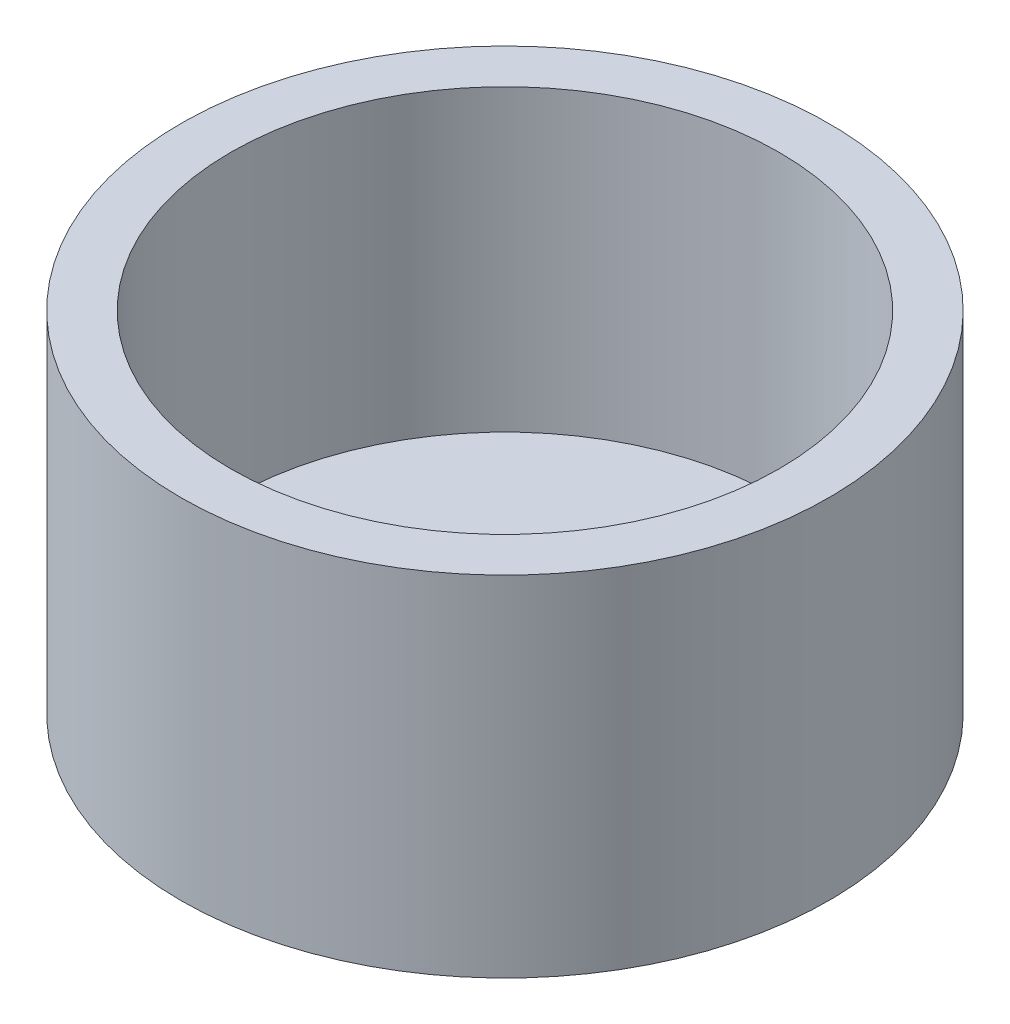
ISO-10303-21;
HEADER;
FILE_DESCRIPTION(('STEP AP214'),'2;1');
FILE_NAME('part.step','',(''),(''),'','','');
FILE_SCHEMA(('AUTOMOTIVE_DESIGN { 1 0 10303 214 1 1 1 1 }'));
ENDSEC;
DATA;
#1=APPLICATION_CONTEXT('core data for automotive mechanical design processes');
#2=APPLICATION_PROTOCOL_DEFINITION('international standard','automotive_design',2000,#1);
#3=PRODUCT_CONTEXT('',#1,'mechanical');
#4=PRODUCT('Part','Part','',(#3));
#5=PRODUCT_RELATED_PRODUCT_CATEGORY('part','',(#4));
#6=PRODUCT_DEFINITION_FORMATION('','',#4);
#7=PRODUCT_DEFINITION_CONTEXT('part definition',#1,'design');
#8=PRODUCT_DEFINITION('design','',#6,#7);
#9=PRODUCT_DEFINITION_SHAPE('','',#8);
#10=(LENGTH_UNIT() NAMED_UNIT(*) SI_UNIT(.MILLI.,.METRE.));
#11=(NAMED_UNIT(*) PLANE_ANGLE_UNIT() SI_UNIT($,.RADIAN.));
#12=(NAMED_UNIT(*) SI_UNIT($,.STERADIAN.) SOLID_ANGLE_UNIT());
#13=UNCERTAINTY_MEASURE_WITH_UNIT(LENGTH_MEASURE(1.E-05),#10,'distance_accuracy_value','');
#14=(GEOMETRIC_REPRESENTATION_CONTEXT(3) GLOBAL_UNCERTAINTY_ASSIGNED_CONTEXT((#13)) GLOBAL_UNIT_ASSIGNED_CONTEXT((#10,
#11,#12)) REPRESENTATION_CONTEXT('',''));
#15=CARTESIAN_POINT('',(0.,0.,0.));
#16=DIRECTION('',(0.,0.,1.));
#17=DIRECTION('',(1.,0.,0.));
#18=AXIS2_PLACEMENT_3D('',#15,#16,#17);
#19=CARTESIAN_POINT('',(0.,25.4,0.));
#20=DIRECTION('',(0.,-1.,0.));
#21=DIRECTION('',(0.,0.,-1.));
#22=AXIS2_PLACEMENT_3D('',#19,#20,#21);
#23=CYLINDRICAL_SURFACE('',#22,165.1);
#24=CARTESIAN_POINT('',(0.,0.,0.));
#25=DIRECTION('',(0.,1.,0.));
#26=DIRECTION('',(0.,0.,1.));
#27=AXIS2_PLACEMENT_3D('',#24,#25,#26);
#28=CIRCLE('',#27,165.1);
#29=CARTESIAN_POINT('',(0.,0.,165.1));
#30=VERTEX_POINT('',#29);
#31=EDGE_CURVE('E44',#30,#30,#28,.T.);
#32=ORIENTED_EDGE('',*,*,#31,.T.);
#33=EDGE_LOOP('',(#32));
#34=FACE_BOUND('',#33,.T.);
#35=CARTESIAN_POINT('',(0.,177.8,0.));
#36=DIRECTION('',(0.,1.,0.));
#37=DIRECTION('',(0.,0.,1.));
#38=AXIS2_PLACEMENT_3D('',#35,#36,#37);
#39=CIRCLE('',#38,165.1);
#40=CARTESIAN_POINT('',(0.,177.8,165.1));
#41=VERTEX_POINT('',#40);
#42=EDGE_CURVE('E49',#41,#41,#39,.T.);
#43=ORIENTED_EDGE('',*,*,#42,.F.);
#44=EDGE_LOOP('',(#43));
#45=FACE_BOUND('',#44,.T.);
#46=ADVANCED_FACE('F37',(#34,#45),#23,.T.);
#47=CARTESIAN_POINT('',(0.,0.,0.));
#48=DIRECTION('',(0.,1.,0.));
#49=DIRECTION('',(0.,0.,1.));
#50=AXIS2_PLACEMENT_3D('',#47,#48,#49);
#51=PLANE('',#50);
#52=ORIENTED_EDGE('',*,*,#31,.F.);
#53=EDGE_LOOP('',(#52));
#54=FACE_BOUND('',#53,.T.);
#55=ADVANCED_FACE('F65',(#54),#51,.F.);
#56=CARTESIAN_POINT('',(0.,177.8,0.));
#57=DIRECTION('',(0.,1.,0.));
#58=DIRECTION('',(0.,0.,1.));
#59=AXIS2_PLACEMENT_3D('',#56,#57,#58);
#60=PLANE('',#59);
#61=ORIENTED_EDGE('',*,*,#42,.T.);
#62=EDGE_LOOP('',(#61));
#63=FACE_BOUND('',#62,.T.);
#64=CARTESIAN_POINT('',(0.,177.8,0.));
#65=DIRECTION('',(0.,1.,0.));
#66=DIRECTION('',(0.,0.,1.));
#67=AXIS2_PLACEMENT_3D('',#64,#65,#66);
#68=CIRCLE('',#67,139.7);
#69=CARTESIAN_POINT('',(0.,177.8,-139.7));
#70=VERTEX_POINT('',#69);
#71=EDGE_CURVE('E54',#70,#70,#68,.T.);
#72=ORIENTED_EDGE('',*,*,#71,.F.);
#73=EDGE_LOOP('',(#72));
#74=FACE_BOUND('',#73,.T.);
#75=ADVANCED_FACE('F63',(#63,#74),#60,.T.);
#76=CARTESIAN_POINT('',(0.,177.8,0.));
#77=DIRECTION('',(0.,-1.,0.));
#78=DIRECTION('',(0.,0.,-1.));
#79=AXIS2_PLACEMENT_3D('',#76,#77,#78);
#80=CYLINDRICAL_SURFACE('',#79,139.7);
#81=CARTESIAN_POINT('',(0.,25.4,0.));
#82=DIRECTION('',(0.,1.,0.));
#83=DIRECTION('',(0.,0.,1.));
#84=AXIS2_PLACEMENT_3D('',#81,#82,#83);
#85=CIRCLE('',#84,139.7);
#86=CARTESIAN_POINT('',(0.,25.4,-139.7));
#87=VERTEX_POINT('',#86);
#88=EDGE_CURVE('E10',#87,#87,#85,.F.);
#89=CARTESIAN_POINT('',(0.,177.8,-139.7));
#90=CARTESIAN_POINT('',(0.,176.2125,-139.7));
#91=CARTESIAN_POINT('',(0.,174.625,-139.7));
#92=CARTESIAN_POINT('',(0.,171.45,-139.7));
#93=CARTESIAN_POINT('',(0.,169.8625,-139.7));
#94=CARTESIAN_POINT('',(0.,166.6875,-139.7));
#95=CARTESIAN_POINT('',(0.,165.1,-139.7));
#96=CARTESIAN_POINT('',(0.,161.925,-139.7));
#97=CARTESIAN_POINT('',(0.,160.3375,-139.7));
#98=CARTESIAN_POINT('',(0.,157.1625,-139.7));
#99=CARTESIAN_POINT('',(0.,155.575,-139.7));
#100=CARTESIAN_POINT('',(0.,152.4,-139.7));
#101=CARTESIAN_POINT('',(0.,150.8125,-139.7));
#102=CARTESIAN_POINT('',(0.,147.6375,-139.7));
#103=CARTESIAN_POINT('',(0.,146.05,-139.7));
#104=CARTESIAN_POINT('',(0.,142.875,-139.7));
#105=CARTESIAN_POINT('',(0.,141.2875,-139.7));
#106=CARTESIAN_POINT('',(0.,138.1125,-139.7));
#107=CARTESIAN_POINT('',(0.,136.525,-139.7));
#108=CARTESIAN_POINT('',(0.,133.35,-139.7));
#109=CARTESIAN_POINT('',(0.,131.7625,-139.7));
#110=CARTESIAN_POINT('',(0.,128.5875,-139.7));
#111=CARTESIAN_POINT('',(0.,127.,-139.7));
#112=CARTESIAN_POINT('',(0.,123.825,-139.7));
#113=CARTESIAN_POINT('',(0.,122.2375,-139.7));
#114=CARTESIAN_POINT('',(0.,119.0625,-139.7));
#115=CARTESIAN_POINT('',(0.,117.475,-139.7));
#116=CARTESIAN_POINT('',(0.,114.3,-139.7));
#117=CARTESIAN_POINT('',(0.,112.7125,-139.7));
#118=CARTESIAN_POINT('',(0.,109.5375,-139.7));
#119=CARTESIAN_POINT('',(0.,107.95,-139.7));
#120=CARTESIAN_POINT('',(0.,104.775,-139.7));
#121=CARTESIAN_POINT('',(0.,103.1875,-139.7));
#122=CARTESIAN_POINT('',(0.,100.0125,-139.7));
#123=CARTESIAN_POINT('',(0.,98.425,-139.7));
#124=CARTESIAN_POINT('',(0.,95.25,-139.7));
#125=CARTESIAN_POINT('',(0.,93.6625,-139.7));
#126=CARTESIAN_POINT('',(0.,90.4875,-139.7));
#127=CARTESIAN_POINT('',(0.,88.9,-139.7));
#128=CARTESIAN_POINT('',(0.,85.725,-139.7));
#129=CARTESIAN_POINT('',(0.,84.1375,-139.7));
#130=CARTESIAN_POINT('',(0.,80.9625,-139.7));
#131=CARTESIAN_POINT('',(0.,79.375,-139.7));
#132=CARTESIAN_POINT('',(0.,76.2,-139.7));
#133=CARTESIAN_POINT('',(0.,74.6125,-139.7));
#134=CARTESIAN_POINT('',(0.,71.4375,-139.7));
#135=CARTESIAN_POINT('',(0.,69.85,-139.7));
#136=CARTESIAN_POINT('',(0.,66.675,-139.7));
#137=CARTESIAN_POINT('',(0.,65.0875,-139.7));
#138=CARTESIAN_POINT('',(0.,61.9125,-139.7));
#139=CARTESIAN_POINT('',(0.,60.325,-139.7));
#140=CARTESIAN_POINT('',(0.,57.15,-139.7));
#141=CARTESIAN_POINT('',(0.,55.5625,-139.7));
#142=CARTESIAN_POINT('',(0.,52.3875,-139.7));
#143=CARTESIAN_POINT('',(0.,50.8,-139.7));
#144=CARTESIAN_POINT('',(0.,47.625,-139.7));
#145=CARTESIAN_POINT('',(0.,46.0375,-139.7));
#146=CARTESIAN_POINT('',(0.,42.8625,-139.7));
#147=CARTESIAN_POINT('',(0.,41.275,-139.7));
#148=CARTESIAN_POINT('',(0.,38.1,-139.7));
#149=CARTESIAN_POINT('',(0.,36.5125,-139.7));
#150=CARTESIAN_POINT('',(0.,33.3375,-139.7));
#151=CARTESIAN_POINT('',(0.,31.75,-139.7));
#152=CARTESIAN_POINT('',(0.,28.575,-139.7));
#153=CARTESIAN_POINT('',(0.,26.9875,-139.7));
#154=CARTESIAN_POINT('',(0.,25.4,-139.7));
#155=B_SPLINE_CURVE_WITH_KNOTS('',3,(#89,#90,#91,#92,#93,#94,#95,#96,#97,#98,#99,#100,#101,#102,
#103,#104,#105,#106,#107,#108,#109,#110,#111,#112,#113,#114,#115,#116,#117,#118,#119,#120,#121,
#122,#123,#124,#125,#126,#127,#128,#129,#130,#131,#132,#133,#134,#135,#136,#137,#138,#139,#140,
#141,#142,#143,#144,#145,#146,#147,#148,#149,#150,#151,#152,#153,#154),.UNSPECIFIED.,.F.,.F.,(4,
2,2,2,2,2,2,2,2,2,2,2,2,2,2,2,2,2,2,2,2,2,2,2,2,2,2,2,2,2,2,2,4),(0.,4.76249999999998,
9.52499999999998,14.2875,19.05,23.8125,28.575,33.3375,38.1,42.8625,47.625,52.3875,57.15,61.9125,
66.675,71.4375,76.2,80.9625,85.725,90.4875,95.25,100.0125,104.775,109.5375,114.3,119.0625,
123.825,128.5875,133.35,138.1125,142.875,147.6375,152.4),.UNSPECIFIED.);
#156=EDGE_CURVE('BSEAM61',#70,#87,#155,.T.);
#157=ORIENTED_EDGE('',*,*,#71,.T.);
#158=ORIENTED_EDGE('',*,*,#88,.T.);
#159=ORIENTED_EDGE('',*,*,#156,.T.);
#160=ORIENTED_EDGE('',*,*,#156,.F.);
#161=EDGE_LOOP('',(#157,#159,#158,#160));
#162=FACE_BOUND('',#161,.T.);
#163=ADVANCED_FACE('F61',(#162),#80,.F.);
#164=CARTESIAN_POINT('',(0.,25.4,0.));
#165=DIRECTION('',(0.,1.,0.));
#166=DIRECTION('',(0.,0.,1.));
#167=AXIS2_PLACEMENT_3D('',#164,#165,#166);
#168=PLANE('',#167);
#169=ORIENTED_EDGE('',*,*,#88,.F.);
#170=EDGE_LOOP('',(#169));
#171=FACE_BOUND('',#170,.T.);
#172=ADVANCED_FACE('F72',(#171),#168,.T.);
#173=CLOSED_SHELL('',(#46,#55,#75,#163,#172));
#174=MANIFOLD_SOLID_BREP('B2',#173);
#175=ADVANCED_BREP_SHAPE_REPRESENTATION('',(#18,#174),#14);
#176=SHAPE_DEFINITION_REPRESENTATION(#9,#175);
ENDSEC;
END-ISO-10303-21;
